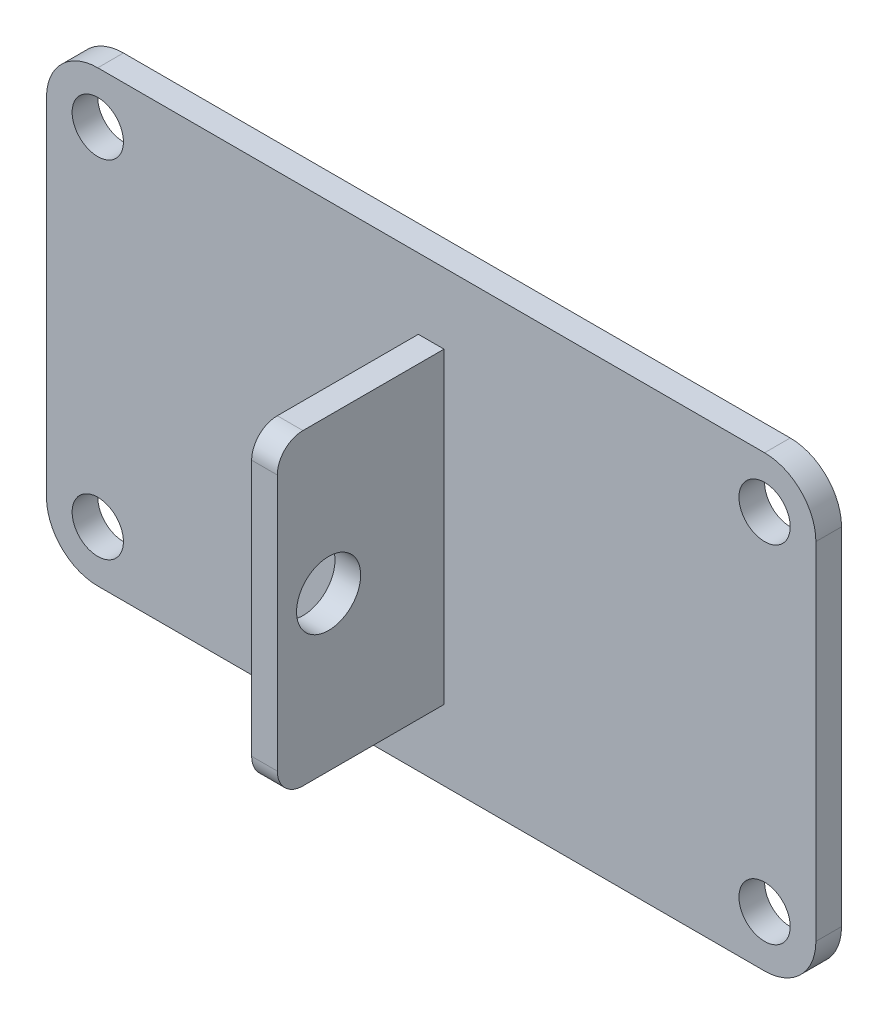
ISO-10303-21;
HEADER;
FILE_DESCRIPTION(('STEP AP214'),'2;1');
FILE_NAME('part.step','',(''),(''),'','','');
FILE_SCHEMA(('AUTOMOTIVE_DESIGN { 1 0 10303 214 1 1 1 1 }'));
ENDSEC;
DATA;
#1=APPLICATION_CONTEXT('core data for automotive mechanical design processes');
#2=APPLICATION_PROTOCOL_DEFINITION('international standard','automotive_design',2000,#1);
#3=PRODUCT_CONTEXT('',#1,'mechanical');
#4=PRODUCT('Part','Part','',(#3));
#5=PRODUCT_RELATED_PRODUCT_CATEGORY('part','',(#4));
#6=PRODUCT_DEFINITION_FORMATION('','',#4);
#7=PRODUCT_DEFINITION_CONTEXT('part definition',#1,'design');
#8=PRODUCT_DEFINITION('design','',#6,#7);
#9=PRODUCT_DEFINITION_SHAPE('','',#8);
#10=(LENGTH_UNIT() NAMED_UNIT(*) SI_UNIT(.MILLI.,.METRE.));
#11=(NAMED_UNIT(*) PLANE_ANGLE_UNIT() SI_UNIT($,.RADIAN.));
#12=(NAMED_UNIT(*) SI_UNIT($,.STERADIAN.) SOLID_ANGLE_UNIT());
#13=UNCERTAINTY_MEASURE_WITH_UNIT(LENGTH_MEASURE(1.E-05),#10,'distance_accuracy_value','');
#14=(GEOMETRIC_REPRESENTATION_CONTEXT(3) GLOBAL_UNCERTAINTY_ASSIGNED_CONTEXT((#13)) GLOBAL_UNIT_ASSIGNED_CONTEXT((#10,
#11,#12)) REPRESENTATION_CONTEXT('',''));
#15=CARTESIAN_POINT('',(0.,0.,0.));
#16=DIRECTION('',(0.,0.,1.));
#17=DIRECTION('',(1.,0.,0.));
#18=AXIS2_PLACEMENT_3D('',#15,#16,#17);
#19=CARTESIAN_POINT('',(130.,67.5,10.));
#20=DIRECTION('',(0.,0.,1.));
#21=DIRECTION('',(1.,0.,0.));
#22=AXIS2_PLACEMENT_3D('',#19,#20,#21);
#23=PLANE('',#22);
#24=CARTESIAN_POINT('',(130.,-67.5,10.));
#25=DIRECTION('',(0.,0.,1.));
#26=DIRECTION('',(1.,0.,0.));
#27=AXIS2_PLACEMENT_3D('',#24,#25,#26);
#28=CIRCLE('',#27,10.);
#29=CARTESIAN_POINT('',(140.,-67.5,10.));
#30=VERTEX_POINT('',#29);
#31=EDGE_CURVE('E197',#30,#30,#28,.T.);
#32=ORIENTED_EDGE('',*,*,#31,.F.);
#33=EDGE_LOOP('',(#32));
#34=FACE_BOUND('',#33,.T.);
#35=CARTESIAN_POINT('',(-130.,67.5,10.));
#36=DIRECTION('',(0.,0.,1.));
#37=DIRECTION('',(1.,0.,0.));
#38=AXIS2_PLACEMENT_3D('',#35,#36,#37);
#39=CIRCLE('',#38,9.99999999999999);
#40=CARTESIAN_POINT('',(-120.,67.5,10.));
#41=VERTEX_POINT('',#40);
#42=EDGE_CURVE('E213',#41,#41,#39,.T.);
#43=ORIENTED_EDGE('',*,*,#42,.F.);
#44=EDGE_LOOP('',(#43));
#45=FACE_BOUND('',#44,.T.);
#46=CARTESIAN_POINT('',(130.,67.5,10.));
#47=DIRECTION('',(0.,0.,1.));
#48=DIRECTION('',(1.,0.,0.));
#49=AXIS2_PLACEMENT_3D('',#46,#47,#48);
#50=CIRCLE('',#49,20.);
#51=CARTESIAN_POINT('',(150.,67.5,10.));
#52=VERTEX_POINT('',#51);
#53=CARTESIAN_POINT('',(130.,87.5,10.));
#54=VERTEX_POINT('',#53);
#55=EDGE_CURVE('E221',#52,#54,#50,.T.);
#56=ORIENTED_EDGE('',*,*,#55,.T.);
#57=DIRECTION('',(-1.,0.,0.));
#58=VECTOR('',#57,1.);
#59=CARTESIAN_POINT('',(-130.,87.5,10.));
#60=LINE('',#59,#58);
#61=CARTESIAN_POINT('',(-130.,87.5,10.));
#62=VERTEX_POINT('',#61);
#63=EDGE_CURVE('E225',#54,#62,#60,.T.);
#64=ORIENTED_EDGE('',*,*,#63,.T.);
#65=CARTESIAN_POINT('',(-130.,67.5,10.));
#66=DIRECTION('',(0.,0.,1.));
#67=DIRECTION('',(-1.,0.,0.));
#68=AXIS2_PLACEMENT_3D('',#65,#66,#67);
#69=CIRCLE('',#68,20.);
#70=CARTESIAN_POINT('',(-150.,67.5,10.));
#71=VERTEX_POINT('',#70);
#72=EDGE_CURVE('E229',#62,#71,#69,.T.);
#73=ORIENTED_EDGE('',*,*,#72,.T.);
#74=DIRECTION('',(0.,-1.,0.));
#75=VECTOR('',#74,1.);
#76=CARTESIAN_POINT('',(-150.,67.5,10.));
#77=LINE('',#76,#75);
#78=CARTESIAN_POINT('',(-150.,-67.5,10.));
#79=VERTEX_POINT('',#78);
#80=EDGE_CURVE('E232',#71,#79,#77,.T.);
#81=ORIENTED_EDGE('',*,*,#80,.T.);
#82=CARTESIAN_POINT('',(-130.,-67.5,10.));
#83=DIRECTION('',(0.,0.,1.));
#84=DIRECTION('',(-1.,0.,0.));
#85=AXIS2_PLACEMENT_3D('',#82,#83,#84);
#86=CIRCLE('',#85,20.);
#87=CARTESIAN_POINT('',(-130.,-87.5,10.));
#88=VERTEX_POINT('',#87);
#89=EDGE_CURVE('E235',#79,#88,#86,.T.);
#90=ORIENTED_EDGE('',*,*,#89,.T.);
#91=DIRECTION('',(1.,0.,0.));
#92=VECTOR('',#91,1.);
#93=CARTESIAN_POINT('',(-130.,-87.5,10.));
#94=LINE('',#93,#92);
#95=CARTESIAN_POINT('',(130.,-87.5,10.));
#96=VERTEX_POINT('',#95);
#97=EDGE_CURVE('E238',#88,#96,#94,.T.);
#98=ORIENTED_EDGE('',*,*,#97,.T.);
#99=CARTESIAN_POINT('',(130.,-67.5,10.));
#100=DIRECTION('',(0.,0.,1.));
#101=DIRECTION('',(1.,0.,0.));
#102=AXIS2_PLACEMENT_3D('',#99,#100,#101);
#103=CIRCLE('',#102,20.);
#104=CARTESIAN_POINT('',(150.,-67.5,10.));
#105=VERTEX_POINT('',#104);
#106=EDGE_CURVE('E241',#96,#105,#103,.T.);
#107=ORIENTED_EDGE('',*,*,#106,.T.);
#108=DIRECTION('',(0.,1.,0.));
#109=VECTOR('',#108,1.);
#110=CARTESIAN_POINT('',(150.,67.5,10.));
#111=LINE('',#110,#109);
#112=EDGE_CURVE('E244',#105,#52,#111,.T.);
#113=ORIENTED_EDGE('',*,*,#112,.T.);
#114=EDGE_LOOP('',(#56,#64,#73,#81,#90,#98,#107,#113));
#115=FACE_BOUND('',#114,.T.);
#116=CARTESIAN_POINT('',(-130.,-67.5,10.));
#117=DIRECTION('',(0.,0.,1.));
#118=DIRECTION('',(1.,0.,0.));
#119=AXIS2_PLACEMENT_3D('',#116,#117,#118);
#120=CIRCLE('',#119,9.99999999999999);
#121=CARTESIAN_POINT('',(-120.,-67.5,10.));
#122=VERTEX_POINT('',#121);
#123=EDGE_CURVE('E205',#122,#122,#120,.T.);
#124=ORIENTED_EDGE('',*,*,#123,.F.);
#125=EDGE_LOOP('',(#124));
#126=FACE_BOUND('',#125,.T.);
#127=CARTESIAN_POINT('',(130.,67.5,10.));
#128=DIRECTION('',(0.,0.,1.));
#129=DIRECTION('',(1.,0.,0.));
#130=AXIS2_PLACEMENT_3D('',#127,#128,#129);
#131=CIRCLE('',#130,10.);
#132=CARTESIAN_POINT('',(140.,67.5,10.));
#133=VERTEX_POINT('',#132);
#134=EDGE_CURVE('E189',#133,#133,#131,.T.);
#135=ORIENTED_EDGE('',*,*,#134,.F.);
#136=EDGE_LOOP('',(#135));
#137=FACE_BOUND('',#136,.T.);
#138=DIRECTION('',(-1.,0.,0.));
#139=VECTOR('',#138,1.);
#140=CARTESIAN_POINT('',(-5.00000000000001,60.,10.));
#141=LINE('',#140,#139);
#142=CARTESIAN_POINT('',(4.99999999999999,60.,10.));
#143=VERTEX_POINT('',#142);
#144=CARTESIAN_POINT('',(-5.00000000000001,60.,10.));
#145=VERTEX_POINT('',#144);
#146=EDGE_CURVE('E150',#143,#145,#141,.T.);
#147=ORIENTED_EDGE('',*,*,#146,.F.);
#148=DIRECTION('',(0.,1.,0.));
#149=VECTOR('',#148,1.);
#150=CARTESIAN_POINT('',(4.99999999999999,60.,10.));
#151=LINE('',#150,#149);
#152=CARTESIAN_POINT('',(5.00000000000001,-60.,10.));
#153=VERTEX_POINT('',#152);
#154=EDGE_CURVE('E160',#153,#143,#151,.T.);
#155=ORIENTED_EDGE('',*,*,#154,.F.);
#156=DIRECTION('',(1.,0.,0.));
#157=VECTOR('',#156,1.);
#158=CARTESIAN_POINT('',(-4.99999999999999,-60.,10.));
#159=LINE('',#158,#157);
#160=CARTESIAN_POINT('',(-5.,-60.,10.));
#161=VERTEX_POINT('',#160);
#162=EDGE_CURVE('E174',#161,#153,#159,.T.);
#163=ORIENTED_EDGE('',*,*,#162,.F.);
#164=DIRECTION('',(0.,-1.,0.));
#165=VECTOR('',#164,1.);
#166=CARTESIAN_POINT('',(-5.00000000000001,60.,10.));
#167=LINE('',#166,#165);
#168=EDGE_CURVE('E170',#145,#161,#167,.T.);
#169=ORIENTED_EDGE('',*,*,#168,.F.);
#170=EDGE_LOOP('',(#147,#155,#163,#169));
#171=FACE_BOUND('',#170,.T.);
#172=ADVANCED_FACE('F43',(#34,#45,#115,#126,#137,#171),#23,.T.);
#173=CARTESIAN_POINT('',(130.,67.5,0.));
#174=DIRECTION('',(0.,0.,1.));
#175=DIRECTION('',(1.,0.,0.));
#176=AXIS2_PLACEMENT_3D('',#173,#174,#175);
#177=PLANE('',#176);
#178=CARTESIAN_POINT('',(130.,67.5,0.));
#179=DIRECTION('',(0.,0.,1.));
#180=DIRECTION('',(1.,0.,0.));
#181=AXIS2_PLACEMENT_3D('',#178,#179,#180);
#182=CIRCLE('',#181,20.);
#183=CARTESIAN_POINT('',(150.,67.5,0.));
#184=VERTEX_POINT('',#183);
#185=CARTESIAN_POINT('',(130.,87.5,0.));
#186=VERTEX_POINT('',#185);
#187=EDGE_CURVE('E217',#184,#186,#182,.T.);
#188=ORIENTED_EDGE('',*,*,#187,.F.);
#189=DIRECTION('',(0.,1.,0.));
#190=VECTOR('',#189,1.);
#191=CARTESIAN_POINT('',(150.,67.5,0.));
#192=LINE('',#191,#190);
#193=CARTESIAN_POINT('',(150.,-67.5,0.));
#194=VERTEX_POINT('',#193);
#195=EDGE_CURVE('E226',#194,#184,#192,.T.);
#196=ORIENTED_EDGE('',*,*,#195,.F.);
#197=CARTESIAN_POINT('',(130.,-67.5,0.));
#198=DIRECTION('',(0.,0.,1.));
#199=DIRECTION('',(1.,0.,0.));
#200=AXIS2_PLACEMENT_3D('',#197,#198,#199);
#201=CIRCLE('',#200,20.);
#202=CARTESIAN_POINT('',(130.,-87.5,0.));
#203=VERTEX_POINT('',#202);
#204=EDGE_CURVE('E266',#203,#194,#201,.T.);
#205=ORIENTED_EDGE('',*,*,#204,.F.);
#206=DIRECTION('',(1.,0.,0.));
#207=VECTOR('',#206,1.);
#208=CARTESIAN_POINT('',(-130.,-87.5,0.));
#209=LINE('',#208,#207);
#210=CARTESIAN_POINT('',(-130.,-87.5,0.));
#211=VERTEX_POINT('',#210);
#212=EDGE_CURVE('E263',#211,#203,#209,.T.);
#213=ORIENTED_EDGE('',*,*,#212,.F.);
#214=CARTESIAN_POINT('',(-130.,-67.5,0.));
#215=DIRECTION('',(0.,0.,1.));
#216=DIRECTION('',(-1.,0.,0.));
#217=AXIS2_PLACEMENT_3D('',#214,#215,#216);
#218=CIRCLE('',#217,20.);
#219=CARTESIAN_POINT('',(-150.,-67.5,0.));
#220=VERTEX_POINT('',#219);
#221=EDGE_CURVE('E260',#220,#211,#218,.T.);
#222=ORIENTED_EDGE('',*,*,#221,.F.);
#223=DIRECTION('',(0.,-1.,0.));
#224=VECTOR('',#223,1.);
#225=CARTESIAN_POINT('',(-150.,67.5,0.));
#226=LINE('',#225,#224);
#227=CARTESIAN_POINT('',(-150.,67.5,0.));
#228=VERTEX_POINT('',#227);
#229=EDGE_CURVE('E257',#228,#220,#226,.T.);
#230=ORIENTED_EDGE('',*,*,#229,.F.);
#231=CARTESIAN_POINT('',(-130.,67.5,0.));
#232=DIRECTION('',(0.,0.,1.));
#233=DIRECTION('',(-1.,0.,0.));
#234=AXIS2_PLACEMENT_3D('',#231,#232,#233);
#235=CIRCLE('',#234,20.);
#236=CARTESIAN_POINT('',(-130.,87.5,0.));
#237=VERTEX_POINT('',#236);
#238=EDGE_CURVE('E254',#237,#228,#235,.T.);
#239=ORIENTED_EDGE('',*,*,#238,.F.);
#240=DIRECTION('',(-1.,0.,0.));
#241=VECTOR('',#240,1.);
#242=CARTESIAN_POINT('',(-130.,87.5,0.));
#243=LINE('',#242,#241);
#244=EDGE_CURVE('E251',#186,#237,#243,.T.);
#245=ORIENTED_EDGE('',*,*,#244,.F.);
#246=EDGE_LOOP('',(#188,#196,#205,#213,#222,#230,#239,#245));
#247=FACE_BOUND('',#246,.T.);
#248=CARTESIAN_POINT('',(-130.,67.5,0.));
#249=DIRECTION('',(0.,0.,1.));
#250=DIRECTION('',(1.,0.,0.));
#251=AXIS2_PLACEMENT_3D('',#248,#249,#250);
#252=CIRCLE('',#251,9.99999999999999);
#253=CARTESIAN_POINT('',(-120.,67.5,0.));
#254=VERTEX_POINT('',#253);
#255=EDGE_CURVE('E209',#254,#254,#252,.T.);
#256=ORIENTED_EDGE('',*,*,#255,.T.);
#257=EDGE_LOOP('',(#256));
#258=FACE_BOUND('',#257,.T.);
#259=CARTESIAN_POINT('',(-130.,-67.5,0.));
#260=DIRECTION('',(0.,0.,1.));
#261=DIRECTION('',(1.,0.,0.));
#262=AXIS2_PLACEMENT_3D('',#259,#260,#261);
#263=CIRCLE('',#262,9.99999999999999);
#264=CARTESIAN_POINT('',(-120.,-67.5,0.));
#265=VERTEX_POINT('',#264);
#266=EDGE_CURVE('E201',#265,#265,#263,.T.);
#267=ORIENTED_EDGE('',*,*,#266,.T.);
#268=EDGE_LOOP('',(#267));
#269=FACE_BOUND('',#268,.T.);
#270=CARTESIAN_POINT('',(130.,-67.5,0.));
#271=DIRECTION('',(0.,0.,1.));
#272=DIRECTION('',(1.,0.,0.));
#273=AXIS2_PLACEMENT_3D('',#270,#271,#272);
#274=CIRCLE('',#273,10.);
#275=CARTESIAN_POINT('',(140.,-67.5,0.));
#276=VERTEX_POINT('',#275);
#277=EDGE_CURVE('E193',#276,#276,#274,.T.);
#278=ORIENTED_EDGE('',*,*,#277,.T.);
#279=EDGE_LOOP('',(#278));
#280=FACE_BOUND('',#279,.T.);
#281=CARTESIAN_POINT('',(130.,67.5,0.));
#282=DIRECTION('',(0.,0.,1.));
#283=DIRECTION('',(1.,0.,0.));
#284=AXIS2_PLACEMENT_3D('',#281,#282,#283);
#285=CIRCLE('',#284,10.);
#286=CARTESIAN_POINT('',(140.,67.5,0.));
#287=VERTEX_POINT('',#286);
#288=EDGE_CURVE('E156',#287,#287,#285,.T.);
#289=ORIENTED_EDGE('',*,*,#288,.T.);
#290=EDGE_LOOP('',(#289));
#291=FACE_BOUND('',#290,.T.);
#292=ADVANCED_FACE('F355',(#247,#258,#269,#280,#291),#177,.F.);
#293=CARTESIAN_POINT('',(130.,67.5,10.));
#294=DIRECTION('',(0.,0.,-1.));
#295=DIRECTION('',(-1.,0.,0.));
#296=AXIS2_PLACEMENT_3D('',#293,#294,#295);
#297=CYLINDRICAL_SURFACE('',#296,20.);
#298=ORIENTED_EDGE('',*,*,#187,.T.);
#299=DIRECTION('',(0.,0.,-1.));
#300=VECTOR('',#299,1.);
#301=CARTESIAN_POINT('',(130.,87.5,10.));
#302=LINE('',#301,#300);
#303=EDGE_CURVE('E298',#54,#186,#302,.T.);
#304=ORIENTED_EDGE('',*,*,#303,.F.);
#305=ORIENTED_EDGE('',*,*,#55,.F.);
#306=DIRECTION('',(0.,0.,-1.));
#307=VECTOR('',#306,1.);
#308=CARTESIAN_POINT('',(150.,67.5,10.));
#309=LINE('',#308,#307);
#310=EDGE_CURVE('E247',#52,#184,#309,.T.);
#311=ORIENTED_EDGE('',*,*,#310,.T.);
#312=EDGE_LOOP('',(#298,#304,#305,#311));
#313=FACE_BOUND('',#312,.T.);
#314=ADVANCED_FACE('F361',(#313),#297,.T.);
#315=CARTESIAN_POINT('',(-130.,87.5,10.));
#316=DIRECTION('',(0.,-1.,0.));
#317=DIRECTION('',(0.,0.,-1.));
#318=AXIS2_PLACEMENT_3D('',#315,#316,#317);
#319=PLANE('',#318);
#320=ORIENTED_EDGE('',*,*,#244,.T.);
#321=DIRECTION('',(0.,0.,-1.));
#322=VECTOR('',#321,1.);
#323=CARTESIAN_POINT('',(-130.,87.5,10.));
#324=LINE('',#323,#322);
#325=EDGE_CURVE('E294',#62,#237,#324,.T.);
#326=ORIENTED_EDGE('',*,*,#325,.F.);
#327=ORIENTED_EDGE('',*,*,#63,.F.);
#328=ORIENTED_EDGE('',*,*,#303,.T.);
#329=EDGE_LOOP('',(#320,#326,#327,#328));
#330=FACE_BOUND('',#329,.T.);
#331=ADVANCED_FACE('F393',(#330),#319,.F.);
#332=CARTESIAN_POINT('',(-130.,67.5,10.));
#333=DIRECTION('',(0.,0.,-1.));
#334=DIRECTION('',(-1.,0.,0.));
#335=AXIS2_PLACEMENT_3D('',#332,#333,#334);
#336=CYLINDRICAL_SURFACE('',#335,20.);
#337=ORIENTED_EDGE('',*,*,#238,.T.);
#338=DIRECTION('',(0.,0.,-1.));
#339=VECTOR('',#338,1.);
#340=CARTESIAN_POINT('',(-150.,67.5,10.));
#341=LINE('',#340,#339);
#342=EDGE_CURVE('E290',#71,#228,#341,.T.);
#343=ORIENTED_EDGE('',*,*,#342,.F.);
#344=ORIENTED_EDGE('',*,*,#72,.F.);
#345=ORIENTED_EDGE('',*,*,#325,.T.);
#346=EDGE_LOOP('',(#337,#343,#344,#345));
#347=FACE_BOUND('',#346,.T.);
#348=ADVANCED_FACE('F389',(#347),#336,.T.);
#349=CARTESIAN_POINT('',(-150.,67.5,10.));
#350=DIRECTION('',(1.,0.,0.));
#351=DIRECTION('',(0.,0.,-1.));
#352=AXIS2_PLACEMENT_3D('',#349,#350,#351);
#353=PLANE('',#352);
#354=ORIENTED_EDGE('',*,*,#229,.T.);
#355=DIRECTION('',(0.,0.,-1.));
#356=VECTOR('',#355,1.);
#357=CARTESIAN_POINT('',(-150.,-67.5,10.));
#358=LINE('',#357,#356);
#359=EDGE_CURVE('E286',#79,#220,#358,.T.);
#360=ORIENTED_EDGE('',*,*,#359,.F.);
#361=ORIENTED_EDGE('',*,*,#80,.F.);
#362=ORIENTED_EDGE('',*,*,#342,.T.);
#363=EDGE_LOOP('',(#354,#360,#361,#362));
#364=FACE_BOUND('',#363,.T.);
#365=ADVANCED_FACE('F385',(#364),#353,.F.);
#366=CARTESIAN_POINT('',(-130.,-67.5,10.));
#367=DIRECTION('',(0.,0.,-1.));
#368=DIRECTION('',(-1.,0.,0.));
#369=AXIS2_PLACEMENT_3D('',#366,#367,#368);
#370=CYLINDRICAL_SURFACE('',#369,20.);
#371=ORIENTED_EDGE('',*,*,#221,.T.);
#372=DIRECTION('',(0.,0.,-1.));
#373=VECTOR('',#372,1.);
#374=CARTESIAN_POINT('',(-130.,-87.5,10.));
#375=LINE('',#374,#373);
#376=EDGE_CURVE('E282',#88,#211,#375,.T.);
#377=ORIENTED_EDGE('',*,*,#376,.F.);
#378=ORIENTED_EDGE('',*,*,#89,.F.);
#379=ORIENTED_EDGE('',*,*,#359,.T.);
#380=EDGE_LOOP('',(#371,#377,#378,#379));
#381=FACE_BOUND('',#380,.T.);
#382=ADVANCED_FACE('F381',(#381),#370,.T.);
#383=CARTESIAN_POINT('',(-130.,-87.5,10.));
#384=DIRECTION('',(0.,1.,0.));
#385=DIRECTION('',(0.,0.,1.));
#386=AXIS2_PLACEMENT_3D('',#383,#384,#385);
#387=PLANE('',#386);
#388=ORIENTED_EDGE('',*,*,#212,.T.);
#389=DIRECTION('',(0.,0.,-1.));
#390=VECTOR('',#389,1.);
#391=CARTESIAN_POINT('',(130.,-87.5,10.));
#392=LINE('',#391,#390);
#393=EDGE_CURVE('E278',#96,#203,#392,.T.);
#394=ORIENTED_EDGE('',*,*,#393,.F.);
#395=ORIENTED_EDGE('',*,*,#97,.F.);
#396=ORIENTED_EDGE('',*,*,#376,.T.);
#397=EDGE_LOOP('',(#388,#394,#395,#396));
#398=FACE_BOUND('',#397,.T.);
#399=ADVANCED_FACE('F377',(#398),#387,.F.);
#400=CARTESIAN_POINT('',(130.,-67.5,10.));
#401=DIRECTION('',(0.,0.,-1.));
#402=DIRECTION('',(-1.,0.,0.));
#403=AXIS2_PLACEMENT_3D('',#400,#401,#402);
#404=CYLINDRICAL_SURFACE('',#403,20.);
#405=ORIENTED_EDGE('',*,*,#204,.T.);
#406=DIRECTION('',(0.,0.,-1.));
#407=VECTOR('',#406,1.);
#408=CARTESIAN_POINT('',(150.,-67.5,10.));
#409=LINE('',#408,#407);
#410=EDGE_CURVE('E274',#105,#194,#409,.T.);
#411=ORIENTED_EDGE('',*,*,#410,.F.);
#412=ORIENTED_EDGE('',*,*,#106,.F.);
#413=ORIENTED_EDGE('',*,*,#393,.T.);
#414=EDGE_LOOP('',(#405,#411,#412,#413));
#415=FACE_BOUND('',#414,.T.);
#416=ADVANCED_FACE('F373',(#415),#404,.T.);
#417=CARTESIAN_POINT('',(150.,67.5,10.));
#418=DIRECTION('',(-1.,0.,0.));
#419=DIRECTION('',(0.,-1.,0.));
#420=AXIS2_PLACEMENT_3D('',#417,#418,#419);
#421=PLANE('',#420);
#422=ORIENTED_EDGE('',*,*,#195,.T.);
#423=ORIENTED_EDGE('',*,*,#310,.F.);
#424=ORIENTED_EDGE('',*,*,#112,.F.);
#425=ORIENTED_EDGE('',*,*,#410,.T.);
#426=EDGE_LOOP('',(#422,#423,#424,#425));
#427=FACE_BOUND('',#426,.T.);
#428=ADVANCED_FACE('F370',(#427),#421,.F.);
#429=CARTESIAN_POINT('',(-130.,67.5,10.));
#430=DIRECTION('',(0.,0.,-1.));
#431=DIRECTION('',(-1.,0.,0.));
#432=AXIS2_PLACEMENT_3D('',#429,#430,#431);
#433=CYLINDRICAL_SURFACE('',#432,9.99999999999999);
#434=ORIENTED_EDGE('',*,*,#42,.T.);
#435=EDGE_LOOP('',(#434));
#436=FACE_BOUND('',#435,.T.);
#437=ORIENTED_EDGE('',*,*,#255,.F.);
#438=EDGE_LOOP('',(#437));
#439=FACE_BOUND('',#438,.T.);
#440=ADVANCED_FACE('F367',(#436,#439),#433,.F.);
#441=CARTESIAN_POINT('',(-130.,-67.5,10.));
#442=DIRECTION('',(0.,0.,-1.));
#443=DIRECTION('',(-1.,0.,0.));
#444=AXIS2_PLACEMENT_3D('',#441,#442,#443);
#445=CYLINDRICAL_SURFACE('',#444,9.99999999999999);
#446=ORIENTED_EDGE('',*,*,#123,.T.);
#447=EDGE_LOOP('',(#446));
#448=FACE_BOUND('',#447,.T.);
#449=ORIENTED_EDGE('',*,*,#266,.F.);
#450=EDGE_LOOP('',(#449));
#451=FACE_BOUND('',#450,.T.);
#452=ADVANCED_FACE('F422',(#448,#451),#445,.F.);
#453=CARTESIAN_POINT('',(130.,-67.5,10.));
#454=DIRECTION('',(0.,0.,-1.));
#455=DIRECTION('',(-1.,0.,0.));
#456=AXIS2_PLACEMENT_3D('',#453,#454,#455);
#457=CYLINDRICAL_SURFACE('',#456,10.);
#458=ORIENTED_EDGE('',*,*,#31,.T.);
#459=EDGE_LOOP('',(#458));
#460=FACE_BOUND('',#459,.T.);
#461=ORIENTED_EDGE('',*,*,#277,.F.);
#462=EDGE_LOOP('',(#461));
#463=FACE_BOUND('',#462,.T.);
#464=ADVANCED_FACE('F419',(#460,#463),#457,.F.);
#465=CARTESIAN_POINT('',(130.,67.5,10.));
#466=DIRECTION('',(0.,0.,-1.));
#467=DIRECTION('',(-1.,0.,0.));
#468=AXIS2_PLACEMENT_3D('',#465,#466,#467);
#469=CYLINDRICAL_SURFACE('',#468,10.);
#470=ORIENTED_EDGE('',*,*,#134,.T.);
#471=EDGE_LOOP('',(#470));
#472=FACE_BOUND('',#471,.T.);
#473=ORIENTED_EDGE('',*,*,#288,.F.);
#474=EDGE_LOOP('',(#473));
#475=FACE_BOUND('',#474,.T.);
#476=ADVANCED_FACE('F415',(#472,#475),#469,.F.);
#477=CARTESIAN_POINT('',(4.99999999999999,60.,75.));
#478=DIRECTION('',(-1.,0.,0.));
#479=DIRECTION('',(0.,-1.,0.));
#480=AXIS2_PLACEMENT_3D('',#477,#478,#479);
#481=PLANE('',#480);
#482=CARTESIAN_POINT('',(5.,0.,55.));
#483=DIRECTION('',(1.,0.,0.));
#484=DIRECTION('',(0.,1.,0.));
#485=AXIS2_PLACEMENT_3D('',#482,#483,#484);
#486=CIRCLE('',#485,12.5);
#487=CARTESIAN_POINT('',(5.,12.5,55.));
#488=VERTEX_POINT('',#487);
#489=EDGE_CURVE('E337',#488,#488,#486,.T.);
#490=ORIENTED_EDGE('',*,*,#489,.F.);
#491=EDGE_LOOP('',(#490));
#492=FACE_BOUND('',#491,.T.);
#493=DIRECTION('',(0.,1.,0.));
#494=VECTOR('',#493,1.);
#495=CARTESIAN_POINT('',(4.99999999999999,60.,75.));
#496=LINE('',#495,#494);
#497=CARTESIAN_POINT('',(5.,-50.,75.));
#498=VERTEX_POINT('',#497);
#499=CARTESIAN_POINT('',(4.99999999999999,50.,75.));
#500=VERTEX_POINT('',#499);
#501=EDGE_CURVE('E180',#498,#500,#496,.T.);
#502=ORIENTED_EDGE('',*,*,#501,.F.);
#503=CARTESIAN_POINT('',(5.,-50.,65.));
#504=DIRECTION('',(-1.,0.,0.));
#505=DIRECTION('',(0.,-1.,0.));
#506=AXIS2_PLACEMENT_3D('',#503,#504,#505);
#507=CIRCLE('',#506,10.);
#508=CARTESIAN_POINT('',(5.00000000000001,-60.,65.));
#509=VERTEX_POINT('',#508);
#510=EDGE_CURVE('E313',#498,#509,#507,.F.);
#511=ORIENTED_EDGE('',*,*,#510,.T.);
#512=DIRECTION('',(0.,0.,-1.));
#513=VECTOR('',#512,1.);
#514=CARTESIAN_POINT('',(5.00000000000001,-60.,75.));
#515=LINE('',#514,#513);
#516=EDGE_CURVE('E163',#509,#153,#515,.T.);
#517=ORIENTED_EDGE('',*,*,#516,.T.);
#518=ORIENTED_EDGE('',*,*,#154,.T.);
#519=DIRECTION('',(0.,0.,-1.));
#520=VECTOR('',#519,1.);
#521=CARTESIAN_POINT('',(4.99999999999999,60.,75.));
#522=LINE('',#521,#520);
#523=CARTESIAN_POINT('',(4.99999999999999,60.,65.));
#524=VERTEX_POINT('',#523);
#525=EDGE_CURVE('E146',#524,#143,#522,.T.);
#526=ORIENTED_EDGE('',*,*,#525,.F.);
#527=CARTESIAN_POINT('',(4.99999999999999,50.,65.));
#528=DIRECTION('',(-1.,0.,0.));
#529=DIRECTION('',(0.,-1.,0.));
#530=AXIS2_PLACEMENT_3D('',#527,#528,#529);
#531=CIRCLE('',#530,10.);
#532=EDGE_CURVE('E310',#524,#500,#531,.F.);
#533=ORIENTED_EDGE('',*,*,#532,.T.);
#534=EDGE_LOOP('',(#502,#511,#517,#518,#526,#533));
#535=FACE_BOUND('',#534,.T.);
#536=ADVANCED_FACE('F162',(#492,#535),#481,.F.);
#537=CARTESIAN_POINT('',(-5.00000000000001,60.,75.));
#538=DIRECTION('',(0.,-1.,0.));
#539=DIRECTION('',(0.,0.,-1.));
#540=AXIS2_PLACEMENT_3D('',#537,#538,#539);
#541=PLANE('',#540);
#542=DIRECTION('',(0.,0.,-1.));
#543=VECTOR('',#542,1.);
#544=CARTESIAN_POINT('',(-5.00000000000001,60.,75.));
#545=LINE('',#544,#543);
#546=CARTESIAN_POINT('',(-5.00000000000001,60.,65.));
#547=VERTEX_POINT('',#546);
#548=EDGE_CURVE('E157',#547,#145,#545,.T.);
#549=ORIENTED_EDGE('',*,*,#548,.F.);
#550=DIRECTION('',(-1.,0.,0.));
#551=VECTOR('',#550,1.);
#552=CARTESIAN_POINT('',(4.99999999999999,60.,65.));
#553=LINE('',#552,#551);
#554=EDGE_CURVE('E11',#547,#524,#553,.F.);
#555=ORIENTED_EDGE('',*,*,#554,.T.);
#556=ORIENTED_EDGE('',*,*,#525,.T.);
#557=ORIENTED_EDGE('',*,*,#146,.T.);
#558=EDGE_LOOP('',(#549,#555,#556,#557));
#559=FACE_BOUND('',#558,.T.);
#560=ADVANCED_FACE('F148',(#559),#541,.F.);
#561=CARTESIAN_POINT('',(-5.00000000000001,60.,75.));
#562=DIRECTION('',(1.,0.,0.));
#563=DIRECTION('',(0.,1.,0.));
#564=AXIS2_PLACEMENT_3D('',#561,#562,#563);
#565=PLANE('',#564);
#566=CARTESIAN_POINT('',(-5.,0.,55.));
#567=DIRECTION('',(1.,0.,0.));
#568=DIRECTION('',(0.,1.,0.));
#569=AXIS2_PLACEMENT_3D('',#566,#567,#568);
#570=CIRCLE('',#569,12.5);
#571=CARTESIAN_POINT('',(-5.00000000000001,12.5,55.));
#572=VERTEX_POINT('',#571);
#573=EDGE_CURVE('E47',#572,#572,#570,.T.);
#574=ORIENTED_EDGE('',*,*,#573,.T.);
#575=EDGE_LOOP('',(#574));
#576=FACE_BOUND('',#575,.T.);
#577=DIRECTION('',(0.,0.,-1.));
#578=VECTOR('',#577,1.);
#579=CARTESIAN_POINT('',(-4.99999999999999,-60.,75.));
#580=LINE('',#579,#578);
#581=CARTESIAN_POINT('',(-4.99999999999999,-60.,65.));
#582=VERTEX_POINT('',#581);
#583=EDGE_CURVE('E183',#582,#161,#580,.T.);
#584=ORIENTED_EDGE('',*,*,#583,.F.);
#585=CARTESIAN_POINT('',(-5.,-50.,65.));
#586=DIRECTION('',(1.,0.,0.));
#587=DIRECTION('',(0.,1.,0.));
#588=AXIS2_PLACEMENT_3D('',#585,#586,#587);
#589=CIRCLE('',#588,10.);
#590=CARTESIAN_POINT('',(-5.,-50.,75.));
#591=VERTEX_POINT('',#590);
#592=EDGE_CURVE('E53',#582,#591,#589,.F.);
#593=ORIENTED_EDGE('',*,*,#592,.T.);
#594=DIRECTION('',(0.,-1.,0.));
#595=VECTOR('',#594,1.);
#596=CARTESIAN_POINT('',(-5.00000000000001,60.,75.));
#597=LINE('',#596,#595);
#598=CARTESIAN_POINT('',(-5.00000000000001,50.,75.));
#599=VERTEX_POINT('',#598);
#600=EDGE_CURVE('E184',#599,#591,#597,.T.);
#601=ORIENTED_EDGE('',*,*,#600,.F.);
#602=CARTESIAN_POINT('',(-5.00000000000001,50.,65.));
#603=DIRECTION('',(1.,0.,0.));
#604=DIRECTION('',(0.,1.,0.));
#605=AXIS2_PLACEMENT_3D('',#602,#603,#604);
#606=CIRCLE('',#605,10.);
#607=EDGE_CURVE('E60',#599,#547,#606,.F.);
#608=ORIENTED_EDGE('',*,*,#607,.T.);
#609=ORIENTED_EDGE('',*,*,#548,.T.);
#610=ORIENTED_EDGE('',*,*,#168,.T.);
#611=EDGE_LOOP('',(#584,#593,#601,#608,#609,#610));
#612=FACE_BOUND('',#611,.T.);
#613=ADVANCED_FACE('F323',(#576,#612),#565,.F.);
#614=CARTESIAN_POINT('',(-4.99999999999999,-60.,75.));
#615=DIRECTION('',(0.,1.,0.));
#616=DIRECTION('',(0.,0.,1.));
#617=AXIS2_PLACEMENT_3D('',#614,#615,#616);
#618=PLANE('',#617);
#619=ORIENTED_EDGE('',*,*,#516,.F.);
#620=DIRECTION('',(1.,0.,0.));
#621=VECTOR('',#620,1.);
#622=CARTESIAN_POINT('',(-4.99999999999999,-60.,65.));
#623=LINE('',#622,#621);
#624=EDGE_CURVE('E68',#509,#582,#623,.F.);
#625=ORIENTED_EDGE('',*,*,#624,.T.);
#626=ORIENTED_EDGE('',*,*,#583,.T.);
#627=ORIENTED_EDGE('',*,*,#162,.T.);
#628=EDGE_LOOP('',(#619,#625,#626,#627));
#629=FACE_BOUND('',#628,.T.);
#630=ADVANCED_FACE('F332',(#629),#618,.F.);
#631=CARTESIAN_POINT('',(0.,0.,75.));
#632=DIRECTION('',(0.,0.,1.));
#633=DIRECTION('',(1.,0.,0.));
#634=AXIS2_PLACEMENT_3D('',#631,#632,#633);
#635=PLANE('',#634);
#636=ORIENTED_EDGE('',*,*,#600,.T.);
#637=DIRECTION('',(1.,0.,0.));
#638=VECTOR('',#637,1.);
#639=CARTESIAN_POINT('',(5.00000000000001,-50.,75.));
#640=LINE('',#639,#638);
#641=EDGE_CURVE('E306',#591,#498,#640,.T.);
#642=ORIENTED_EDGE('',*,*,#641,.T.);
#643=ORIENTED_EDGE('',*,*,#501,.T.);
#644=DIRECTION('',(-1.,0.,0.));
#645=VECTOR('',#644,1.);
#646=CARTESIAN_POINT('',(-5.00000000000001,50.,75.));
#647=LINE('',#646,#645);
#648=EDGE_CURVE('E302',#500,#599,#647,.T.);
#649=ORIENTED_EDGE('',*,*,#648,.T.);
#650=EDGE_LOOP('',(#636,#642,#643,#649));
#651=FACE_BOUND('',#650,.T.);
#652=ADVANCED_FACE('F327',(#651),#635,.T.);
#653=CARTESIAN_POINT('',(0.,-50.,65.));
#654=DIRECTION('',(-1.,0.,0.));
#655=DIRECTION('',(0.,0.,1.));
#656=AXIS2_PLACEMENT_3D('',#653,#654,#655);
#657=CYLINDRICAL_SURFACE('',#656,10.);
#658=ORIENTED_EDGE('',*,*,#592,.F.);
#659=ORIENTED_EDGE('',*,*,#624,.F.);
#660=ORIENTED_EDGE('',*,*,#510,.F.);
#661=ORIENTED_EDGE('',*,*,#641,.F.);
#662=EDGE_LOOP('',(#658,#659,#660,#661));
#663=FACE_BOUND('',#662,.T.);
#664=ADVANCED_FACE('F331',(#663),#657,.T.);
#665=CARTESIAN_POINT('',(0.,50.,65.));
#666=DIRECTION('',(1.,0.,0.));
#667=DIRECTION('',(0.,0.,-1.));
#668=AXIS2_PLACEMENT_3D('',#665,#666,#667);
#669=CYLINDRICAL_SURFACE('',#668,10.);
#670=ORIENTED_EDGE('',*,*,#532,.F.);
#671=ORIENTED_EDGE('',*,*,#554,.F.);
#672=ORIENTED_EDGE('',*,*,#607,.F.);
#673=ORIENTED_EDGE('',*,*,#648,.F.);
#674=EDGE_LOOP('',(#670,#671,#672,#673));
#675=FACE_BOUND('',#674,.T.);
#676=ADVANCED_FACE('F45',(#675),#669,.T.);
#677=CARTESIAN_POINT('',(-60.,0.,55.));
#678=DIRECTION('',(1.,0.,0.));
#679=DIRECTION('',(0.,1.,0.));
#680=AXIS2_PLACEMENT_3D('',#677,#678,#679);
#681=CYLINDRICAL_SURFACE('',#680,12.5);
#682=ORIENTED_EDGE('',*,*,#489,.T.);
#683=EDGE_LOOP('',(#682));
#684=FACE_BOUND('',#683,.T.);
#685=ORIENTED_EDGE('',*,*,#573,.F.);
#686=EDGE_LOOP('',(#685));
#687=FACE_BOUND('',#686,.T.);
#688=ADVANCED_FACE('F347',(#684,#687),#681,.F.);
#689=CLOSED_SHELL('',(#172,#292,#314,#331,#348,#365,#382,#399,#416,#428,#440,#452,#464,#476,
#536,#560,#613,#630,#652,#664,#676,#688));
#690=MANIFOLD_SOLID_BREP('B2',#689);
#691=ADVANCED_BREP_SHAPE_REPRESENTATION('',(#18,#690),#14);
#692=SHAPE_DEFINITION_REPRESENTATION(#9,#691);
ENDSEC;
END-ISO-10303-21;
